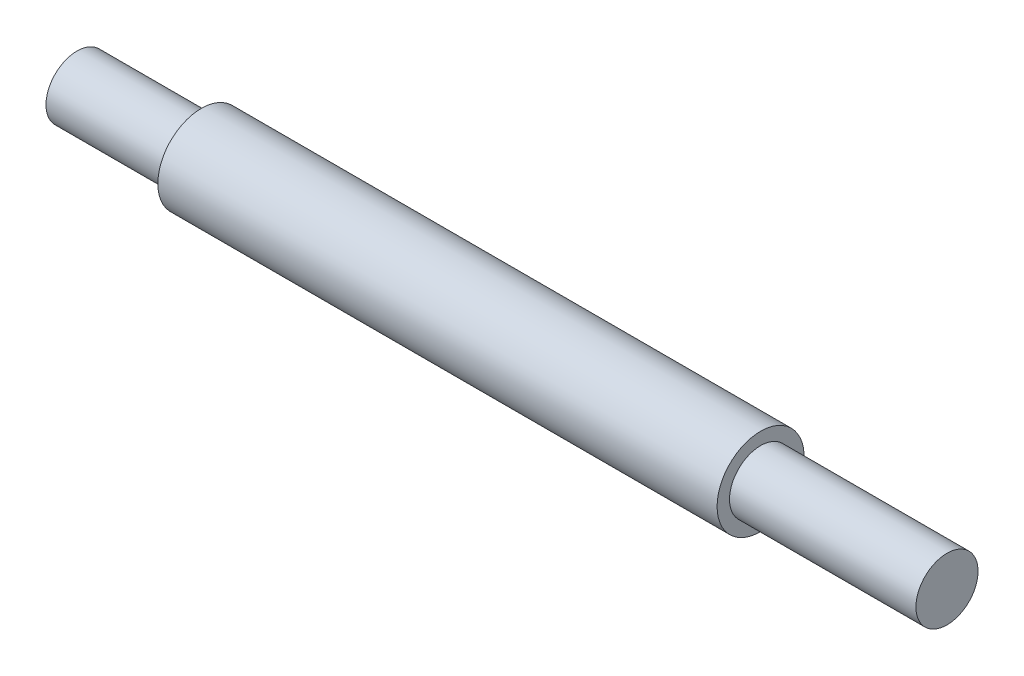
ISO-10303-21;
HEADER;
FILE_DESCRIPTION(('STEP AP214'),'2;1');
FILE_NAME('part.step','',(''),(''),'','','');
FILE_SCHEMA(('AUTOMOTIVE_DESIGN { 1 0 10303 214 1 1 1 1 }'));
ENDSEC;
DATA;
#1=APPLICATION_CONTEXT('core data for automotive mechanical design processes');
#2=APPLICATION_PROTOCOL_DEFINITION('international standard','automotive_design',2000,#1);
#3=PRODUCT_CONTEXT('',#1,'mechanical');
#4=PRODUCT('Part','Part','',(#3));
#5=PRODUCT_RELATED_PRODUCT_CATEGORY('part','',(#4));
#6=PRODUCT_DEFINITION_FORMATION('','',#4);
#7=PRODUCT_DEFINITION_CONTEXT('part definition',#1,'design');
#8=PRODUCT_DEFINITION('design','',#6,#7);
#9=PRODUCT_DEFINITION_SHAPE('','',#8);
#10=(LENGTH_UNIT() NAMED_UNIT(*) SI_UNIT(.MILLI.,.METRE.));
#11=(NAMED_UNIT(*) PLANE_ANGLE_UNIT() SI_UNIT($,.RADIAN.));
#12=(NAMED_UNIT(*) SI_UNIT($,.STERADIAN.) SOLID_ANGLE_UNIT());
#13=UNCERTAINTY_MEASURE_WITH_UNIT(LENGTH_MEASURE(1.E-05),#10,'distance_accuracy_value','');
#14=(GEOMETRIC_REPRESENTATION_CONTEXT(3) GLOBAL_UNCERTAINTY_ASSIGNED_CONTEXT((#13)) GLOBAL_UNIT_ASSIGNED_CONTEXT((#10,
#11,#12)) REPRESENTATION_CONTEXT('',''));
#15=CARTESIAN_POINT('',(0.,0.,0.));
#16=DIRECTION('',(0.,0.,1.));
#17=DIRECTION('',(1.,0.,0.));
#18=AXIS2_PLACEMENT_3D('',#15,#16,#17);
#19=CARTESIAN_POINT('',(0.,0.,-25.));
#20=DIRECTION('',(1.,0.,0.));
#21=DIRECTION('',(0.,0.,-1.));
#22=AXIS2_PLACEMENT_3D('',#19,#20,#21);
#23=PLANE('',#22);
#24=CARTESIAN_POINT('',(0.,0.,0.));
#25=DIRECTION('',(-1.,0.,0.));
#26=DIRECTION('',(0.,0.,1.));
#27=AXIS2_PLACEMENT_3D('',#24,#25,#26);
#28=CIRCLE('',#27,25.);
#29=CARTESIAN_POINT('',(0.,0.,25.));
#30=VERTEX_POINT('',#29);
#31=EDGE_CURVE('E70',#30,#30,#28,.T.);
#32=ORIENTED_EDGE('',*,*,#31,.T.);
#33=EDGE_LOOP('',(#32));
#34=FACE_BOUND('',#33,.T.);
#35=ADVANCED_FACE('F43',(#34),#23,.F.);
#36=CARTESIAN_POINT('',(700.,0.,0.));
#37=DIRECTION('',(-1.,0.,0.));
#38=DIRECTION('',(0.,0.,1.));
#39=AXIS2_PLACEMENT_3D('',#36,#37,#38);
#40=PLANE('',#39);
#41=CARTESIAN_POINT('',(700.,0.,0.));
#42=DIRECTION('',(-1.,0.,0.));
#43=DIRECTION('',(0.,0.,1.));
#44=AXIS2_PLACEMENT_3D('',#41,#42,#43);
#45=CIRCLE('',#44,25.0000000000001);
#46=CARTESIAN_POINT('',(700.,0.,25.0000000000001));
#47=VERTEX_POINT('',#46);
#48=EDGE_CURVE('E10',#47,#47,#45,.T.);
#49=ORIENTED_EDGE('',*,*,#48,.F.);
#50=EDGE_LOOP('',(#49));
#51=FACE_BOUND('',#50,.T.);
#52=ADVANCED_FACE('F101',(#51),#40,.F.);
#53=CARTESIAN_POINT('',(0.,0.,0.));
#54=DIRECTION('',(-1.,0.,0.));
#55=DIRECTION('',(0.,0.,1.));
#56=AXIS2_PLACEMENT_3D('',#53,#54,#55);
#57=CYLINDRICAL_SURFACE('',#56,25.0000000000001);
#58=CARTESIAN_POINT('',(550.,0.,0.));
#59=DIRECTION('',(-1.,0.,0.));
#60=DIRECTION('',(0.,0.,1.));
#61=AXIS2_PLACEMENT_3D('',#58,#59,#60);
#62=CIRCLE('',#61,25.0000000000001);
#63=CARTESIAN_POINT('',(550.,0.,25.0000000000001));
#64=VERTEX_POINT('',#63);
#65=EDGE_CURVE('E50',#64,#64,#62,.T.);
#66=ORIENTED_EDGE('',*,*,#65,.F.);
#67=EDGE_LOOP('',(#66));
#68=FACE_BOUND('',#67,.T.);
#69=ORIENTED_EDGE('',*,*,#48,.T.);
#70=EDGE_LOOP('',(#69));
#71=FACE_BOUND('',#70,.T.);
#72=ADVANCED_FACE('F96',(#68,#71),#57,.T.);
#73=CARTESIAN_POINT('',(550.,0.,-25.0000000000001));
#74=DIRECTION('',(-1.,0.,0.));
#75=DIRECTION('',(0.,0.,1.));
#76=AXIS2_PLACEMENT_3D('',#73,#74,#75);
#77=PLANE('',#76);
#78=CARTESIAN_POINT('',(550.,0.,0.));
#79=DIRECTION('',(-1.,0.,0.));
#80=DIRECTION('',(0.,0.,1.));
#81=AXIS2_PLACEMENT_3D('',#78,#79,#80);
#82=CIRCLE('',#81,35.0000000000001);
#83=CARTESIAN_POINT('',(550.,0.,35.0000000000001));
#84=VERTEX_POINT('',#83);
#85=EDGE_CURVE('E55',#84,#84,#82,.T.);
#86=ORIENTED_EDGE('',*,*,#85,.F.);
#87=EDGE_LOOP('',(#86));
#88=FACE_BOUND('',#87,.T.);
#89=ORIENTED_EDGE('',*,*,#65,.T.);
#90=EDGE_LOOP('',(#89));
#91=FACE_BOUND('',#90,.T.);
#92=ADVANCED_FACE('F91',(#88,#91),#77,.F.);
#93=CARTESIAN_POINT('',(0.,0.,0.));
#94=DIRECTION('',(-1.,0.,0.));
#95=DIRECTION('',(0.,0.,1.));
#96=AXIS2_PLACEMENT_3D('',#93,#94,#95);
#97=CYLINDRICAL_SURFACE('',#96,35.);
#98=CARTESIAN_POINT('',(100.,0.,0.));
#99=DIRECTION('',(-1.,0.,0.));
#100=DIRECTION('',(0.,0.,1.));
#101=AXIS2_PLACEMENT_3D('',#98,#99,#100);
#102=CIRCLE('',#101,35.);
#103=CARTESIAN_POINT('',(100.,0.,35.));
#104=VERTEX_POINT('',#103);
#105=EDGE_CURVE('E60',#104,#104,#102,.T.);
#106=ORIENTED_EDGE('',*,*,#105,.F.);
#107=EDGE_LOOP('',(#106));
#108=FACE_BOUND('',#107,.T.);
#109=ORIENTED_EDGE('',*,*,#85,.T.);
#110=EDGE_LOOP('',(#109));
#111=FACE_BOUND('',#110,.T.);
#112=ADVANCED_FACE('F85',(#108,#111),#97,.T.);
#113=CARTESIAN_POINT('',(100.,0.,-35.));
#114=DIRECTION('',(1.,0.,0.));
#115=DIRECTION('',(0.,0.,-1.));
#116=AXIS2_PLACEMENT_3D('',#113,#114,#115);
#117=PLANE('',#116);
#118=CARTESIAN_POINT('',(100.,0.,0.));
#119=DIRECTION('',(-1.,0.,0.));
#120=DIRECTION('',(0.,0.,1.));
#121=AXIS2_PLACEMENT_3D('',#118,#119,#120);
#122=CIRCLE('',#121,25.);
#123=CARTESIAN_POINT('',(100.,0.,25.));
#124=VERTEX_POINT('',#123);
#125=EDGE_CURVE('E66',#124,#124,#122,.T.);
#126=ORIENTED_EDGE('',*,*,#125,.F.);
#127=EDGE_LOOP('',(#126));
#128=FACE_BOUND('',#127,.T.);
#129=ORIENTED_EDGE('',*,*,#105,.T.);
#130=EDGE_LOOP('',(#129));
#131=FACE_BOUND('',#130,.T.);
#132=ADVANCED_FACE('F79',(#128,#131),#117,.F.);
#133=CARTESIAN_POINT('',(0.,0.,0.));
#134=DIRECTION('',(-1.,0.,0.));
#135=DIRECTION('',(0.,0.,1.));
#136=AXIS2_PLACEMENT_3D('',#133,#134,#135);
#137=CYLINDRICAL_SURFACE('',#136,25.);
#138=ORIENTED_EDGE('',*,*,#31,.F.);
#139=EDGE_LOOP('',(#138));
#140=FACE_BOUND('',#139,.T.);
#141=ORIENTED_EDGE('',*,*,#125,.T.);
#142=EDGE_LOOP('',(#141));
#143=FACE_BOUND('',#142,.T.);
#144=ADVANCED_FACE('F76',(#140,#143),#137,.T.);
#145=CLOSED_SHELL('',(#35,#52,#72,#92,#112,#132,#144));
#146=MANIFOLD_SOLID_BREP('B2',#145);
#147=ADVANCED_BREP_SHAPE_REPRESENTATION('',(#18,#146),#14);
#148=SHAPE_DEFINITION_REPRESENTATION(#9,#147);
ENDSEC;
END-ISO-10303-21;
